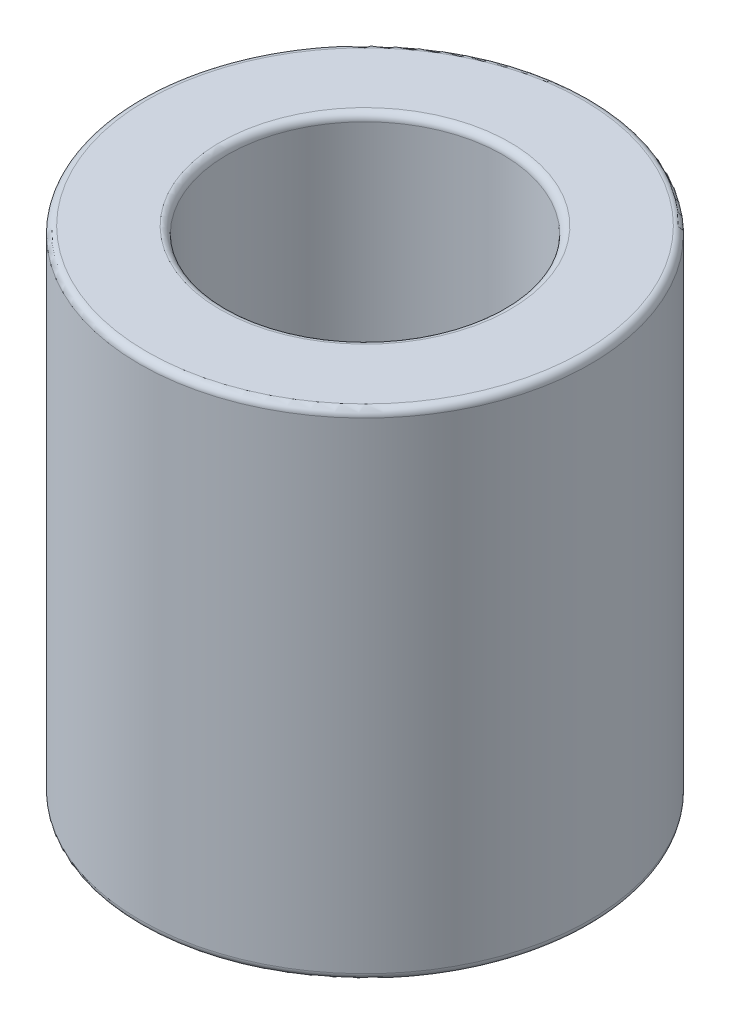
ISO-10303-21;
HEADER;
FILE_DESCRIPTION(('STEP AP214'),'2;1');
FILE_NAME('part.step','',(''),(''),'','','');
FILE_SCHEMA(('AUTOMOTIVE_DESIGN { 1 0 10303 214 1 1 1 1 }'));
ENDSEC;
DATA;
#1=APPLICATION_CONTEXT('core data for automotive mechanical design processes');
#2=APPLICATION_PROTOCOL_DEFINITION('international standard','automotive_design',2000,#1);
#3=PRODUCT_CONTEXT('',#1,'mechanical');
#4=PRODUCT('Part','Part','',(#3));
#5=PRODUCT_RELATED_PRODUCT_CATEGORY('part','',(#4));
#6=PRODUCT_DEFINITION_FORMATION('','',#4);
#7=PRODUCT_DEFINITION_CONTEXT('part definition',#1,'design');
#8=PRODUCT_DEFINITION('design','',#6,#7);
#9=PRODUCT_DEFINITION_SHAPE('','',#8);
#10=(LENGTH_UNIT() NAMED_UNIT(*) SI_UNIT(.MILLI.,.METRE.));
#11=(NAMED_UNIT(*) PLANE_ANGLE_UNIT() SI_UNIT($,.RADIAN.));
#12=(NAMED_UNIT(*) SI_UNIT($,.STERADIAN.) SOLID_ANGLE_UNIT());
#13=UNCERTAINTY_MEASURE_WITH_UNIT(LENGTH_MEASURE(1.E-05),#10,'distance_accuracy_value','');
#14=(GEOMETRIC_REPRESENTATION_CONTEXT(3) GLOBAL_UNCERTAINTY_ASSIGNED_CONTEXT((#13)) GLOBAL_UNIT_ASSIGNED_CONTEXT((#10,
#11,#12)) REPRESENTATION_CONTEXT('',''));
#15=CARTESIAN_POINT('',(0.,0.,0.));
#16=DIRECTION('',(0.,0.,1.));
#17=DIRECTION('',(1.,0.,0.));
#18=AXIS2_PLACEMENT_3D('',#15,#16,#17);
#19=CARTESIAN_POINT('',(0.,17.4625,0.));
#20=DIRECTION('',(0.,-1.,0.));
#21=DIRECTION('',(0.,0.,-1.));
#22=AXIS2_PLACEMENT_3D('',#19,#20,#21);
#23=CYLINDRICAL_SURFACE('',#22,4.8514);
#24=CARTESIAN_POINT('',(0.,17.2085,0.));
#25=DIRECTION('',(0.,1.,0.));
#26=DIRECTION('',(0.,0.,1.));
#27=AXIS2_PLACEMENT_3D('',#24,#25,#26);
#28=CIRCLE('',#27,4.8514);
#29=CARTESIAN_POINT('',(0.,17.2085,4.8514));
#30=VERTEX_POINT('',#29);
#31=EDGE_CURVE('E107',#30,#30,#28,.F.);
#32=ORIENTED_EDGE('',*,*,#31,.F.);
#33=EDGE_LOOP('',(#32));
#34=FACE_BOUND('',#33,.T.);
#35=CARTESIAN_POINT('',(0.,0.254000000000001,0.));
#36=DIRECTION('',(0.,1.,0.));
#37=DIRECTION('',(0.,0.,1.));
#38=AXIS2_PLACEMENT_3D('',#35,#36,#37);
#39=CIRCLE('',#38,4.8514);
#40=CARTESIAN_POINT('',(0.,0.254000000000001,4.8514));
#41=VERTEX_POINT('',#40);
#42=EDGE_CURVE('E111',#41,#41,#39,.T.);
#43=ORIENTED_EDGE('',*,*,#42,.F.);
#44=EDGE_LOOP('',(#43));
#45=FACE_BOUND('',#44,.T.);
#46=ADVANCED_FACE('F14',(#34,#45),#23,.F.);
#47=CARTESIAN_POINT('',(0.,0.254000000000001,0.));
#48=DIRECTION('',(0.,1.,0.));
#49=DIRECTION('',(0.,0.,1.));
#50=AXIS2_PLACEMENT_3D('',#47,#48,#49);
#51=TOROIDAL_SURFACE('',#50,5.1054,0.254);
#52=CARTESIAN_POINT('',(0.,0.,0.));
#53=DIRECTION('',(0.,-1.,0.));
#54=DIRECTION('',(0.,0.,1.));
#55=AXIS2_PLACEMENT_3D('',#52,#53,#54);
#56=CIRCLE('',#55,5.1054);
#57=CARTESIAN_POINT('',(0.,0.,5.1054));
#58=VERTEX_POINT('',#57);
#59=EDGE_CURVE('E110',#58,#58,#56,.T.);
#60=ORIENTED_EDGE('',*,*,#59,.T.);
#61=EDGE_LOOP('',(#60));
#62=FACE_BOUND('',#61,.T.);
#63=ORIENTED_EDGE('',*,*,#42,.T.);
#64=EDGE_LOOP('',(#63));
#65=FACE_BOUND('',#64,.T.);
#66=ADVANCED_FACE('F130',(#62,#65),#51,.T.);
#67=CARTESIAN_POINT('',(0.,17.2085,0.));
#68=DIRECTION('',(0.,1.,0.));
#69=DIRECTION('',(0.,0.,1.));
#70=AXIS2_PLACEMENT_3D('',#67,#68,#69);
#71=TOROIDAL_SURFACE('',#70,5.1054,0.254);
#72=ORIENTED_EDGE('',*,*,#31,.T.);
#73=EDGE_LOOP('',(#72));
#74=FACE_BOUND('',#73,.T.);
#75=CARTESIAN_POINT('',(0.,17.4625,0.));
#76=DIRECTION('',(0.,1.,0.));
#77=DIRECTION('',(0.,0.,1.));
#78=AXIS2_PLACEMENT_3D('',#75,#76,#77);
#79=CIRCLE('',#78,5.1054);
#80=CARTESIAN_POINT('',(0.,17.4625,5.1054));
#81=VERTEX_POINT('',#80);
#82=EDGE_CURVE('E118',#81,#81,#79,.F.);
#83=ORIENTED_EDGE('',*,*,#82,.F.);
#84=EDGE_LOOP('',(#83));
#85=FACE_BOUND('',#84,.T.);
#86=ADVANCED_FACE('F82',(#74,#85),#71,.T.);
#87=CARTESIAN_POINT('',(0.,0.,0.));
#88=DIRECTION('',(0.,1.,0.));
#89=DIRECTION('',(0.,0.,1.));
#90=AXIS2_PLACEMENT_3D('',#87,#88,#89);
#91=PLANE('',#90);
#92=ORIENTED_EDGE('',*,*,#59,.F.);
#93=EDGE_LOOP('',(#92));
#94=FACE_BOUND('',#93,.T.);
#95=CARTESIAN_POINT('',(0.,0.,0.));
#96=DIRECTION('',(0.,1.,0.));
#97=DIRECTION('',(0.,0.,1.));
#98=AXIS2_PLACEMENT_3D('',#95,#96,#97);
#99=CIRCLE('',#98,7.6835);
#100=CARTESIAN_POINT('',(0.,0.,7.6835));
#101=VERTEX_POINT('',#100);
#102=EDGE_CURVE('E65',#101,#101,#99,.T.);
#103=ORIENTED_EDGE('',*,*,#102,.F.);
#104=EDGE_LOOP('',(#103));
#105=FACE_BOUND('',#104,.T.);
#106=ADVANCED_FACE('F72',(#94,#105),#91,.F.);
#107=CARTESIAN_POINT('',(0.,17.4625,0.));
#108=DIRECTION('',(0.,1.,0.));
#109=DIRECTION('',(0.,0.,1.));
#110=AXIS2_PLACEMENT_3D('',#107,#108,#109);
#111=PLANE('',#110);
#112=ORIENTED_EDGE('',*,*,#82,.T.);
#113=EDGE_LOOP('',(#112));
#114=FACE_BOUND('',#113,.T.);
#115=CARTESIAN_POINT('',(0.,17.4625,0.));
#116=DIRECTION('',(0.,-1.,0.));
#117=DIRECTION('',(0.,0.,1.));
#118=AXIS2_PLACEMENT_3D('',#115,#116,#117);
#119=CIRCLE('',#118,7.6835);
#120=CARTESIAN_POINT('',(0.,17.4625,7.6835));
#121=VERTEX_POINT('',#120);
#122=EDGE_CURVE('E27',#121,#121,#119,.T.);
#123=ORIENTED_EDGE('',*,*,#122,.F.);
#124=EDGE_LOOP('',(#123));
#125=FACE_BOUND('',#124,.T.);
#126=ADVANCED_FACE('F81',(#114,#125),#111,.T.);
#127=CARTESIAN_POINT('',(0.,0.254000000000001,0.));
#128=DIRECTION('',(0.,1.,0.));
#129=DIRECTION('',(0.,0.,1.));
#130=AXIS2_PLACEMENT_3D('',#127,#128,#129);
#131=TOROIDAL_SURFACE('',#130,7.6835,0.254);
#132=CARTESIAN_POINT('',(0.,0.254000000000001,0.));
#133=DIRECTION('',(0.,-1.,0.));
#134=DIRECTION('',(0.,0.,-1.));
#135=AXIS2_PLACEMENT_3D('',#132,#133,#134);
#136=CIRCLE('',#135,7.9375);
#137=CARTESIAN_POINT('',(0.,0.254000000000001,-7.9375));
#138=VERTEX_POINT('',#137);
#139=EDGE_CURVE('E22',#138,#138,#136,.F.);
#140=ORIENTED_EDGE('',*,*,#139,.F.);
#141=EDGE_LOOP('',(#140));
#142=FACE_BOUND('',#141,.T.);
#143=ORIENTED_EDGE('',*,*,#102,.T.);
#144=EDGE_LOOP('',(#143));
#145=FACE_BOUND('',#144,.T.);
#146=ADVANCED_FACE('F45',(#142,#145),#131,.T.);
#147=CARTESIAN_POINT('',(0.,17.2085,0.));
#148=DIRECTION('',(0.,1.,0.));
#149=DIRECTION('',(0.,0.,1.));
#150=AXIS2_PLACEMENT_3D('',#147,#148,#149);
#151=TOROIDAL_SURFACE('',#150,7.6835,0.254);
#152=ORIENTED_EDGE('',*,*,#122,.T.);
#153=EDGE_LOOP('',(#152));
#154=FACE_BOUND('',#153,.T.);
#155=CARTESIAN_POINT('',(0.,17.2085,0.));
#156=DIRECTION('',(0.,-1.,0.));
#157=DIRECTION('',(0.,0.,-1.));
#158=AXIS2_PLACEMENT_3D('',#155,#156,#157);
#159=CIRCLE('',#158,7.9375);
#160=CARTESIAN_POINT('',(0.,17.2085,-7.9375));
#161=VERTEX_POINT('',#160);
#162=EDGE_CURVE('E10',#161,#161,#159,.T.);
#163=ORIENTED_EDGE('',*,*,#162,.F.);
#164=EDGE_LOOP('',(#163));
#165=FACE_BOUND('',#164,.T.);
#166=ADVANCED_FACE('F39',(#154,#165),#151,.T.);
#167=CARTESIAN_POINT('',(0.,17.4625,0.));
#168=DIRECTION('',(0.,-1.,0.));
#169=DIRECTION('',(0.,0.,-1.));
#170=AXIS2_PLACEMENT_3D('',#167,#168,#169);
#171=CYLINDRICAL_SURFACE('',#170,7.9375);
#172=ORIENTED_EDGE('',*,*,#162,.T.);
#173=EDGE_LOOP('',(#172));
#174=FACE_BOUND('',#173,.T.);
#175=ORIENTED_EDGE('',*,*,#139,.T.);
#176=EDGE_LOOP('',(#175));
#177=FACE_BOUND('',#176,.T.);
#178=ADVANCED_FACE('F44',(#174,#177),#171,.T.);
#179=CLOSED_SHELL('',(#46,#66,#86,#106,#126,#146,#166,#178));
#180=MANIFOLD_SOLID_BREP('B1',#179);
#181=ADVANCED_BREP_SHAPE_REPRESENTATION('',(#18,#180),#14);
#182=SHAPE_DEFINITION_REPRESENTATION(#9,#181);
ENDSEC;
END-ISO-10303-21;
